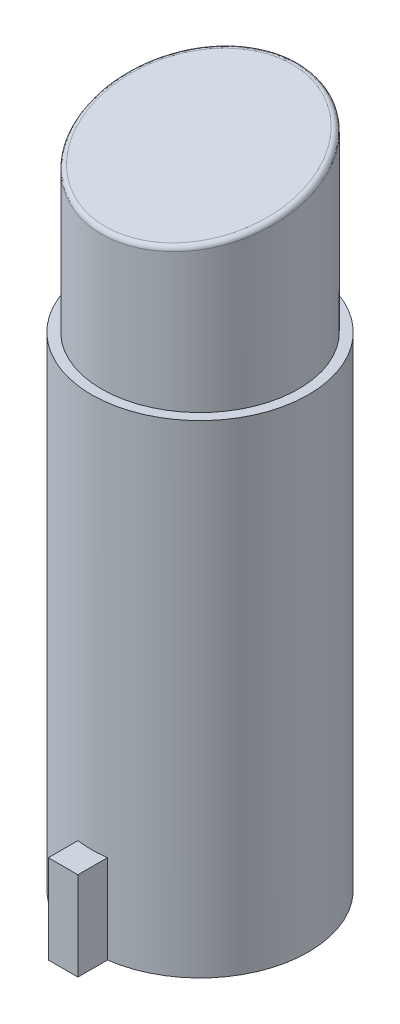
ISO-10303-21;
HEADER;
FILE_DESCRIPTION(('STEP AP214'),'2;1');
FILE_NAME('part.step','',(''),(''),'','','');
FILE_SCHEMA(('AUTOMOTIVE_DESIGN { 1 0 10303 214 1 1 1 1 }'));
ENDSEC;
DATA;
#1=APPLICATION_CONTEXT('core data for automotive mechanical design processes');
#2=APPLICATION_PROTOCOL_DEFINITION('international standard','automotive_design',2000,#1);
#3=PRODUCT_CONTEXT('',#1,'mechanical');
#4=PRODUCT('Part','Part','',(#3));
#5=PRODUCT_RELATED_PRODUCT_CATEGORY('part','',(#4));
#6=PRODUCT_DEFINITION_FORMATION('','',#4);
#7=PRODUCT_DEFINITION_CONTEXT('part definition',#1,'design');
#8=PRODUCT_DEFINITION('design','',#6,#7);
#9=PRODUCT_DEFINITION_SHAPE('','',#8);
#10=(LENGTH_UNIT() NAMED_UNIT(*) SI_UNIT(.MILLI.,.METRE.));
#11=(NAMED_UNIT(*) PLANE_ANGLE_UNIT() SI_UNIT($,.RADIAN.));
#12=(NAMED_UNIT(*) SI_UNIT($,.STERADIAN.) SOLID_ANGLE_UNIT());
#13=UNCERTAINTY_MEASURE_WITH_UNIT(LENGTH_MEASURE(1.E-05),#10,'distance_accuracy_value','');
#14=(GEOMETRIC_REPRESENTATION_CONTEXT(3) GLOBAL_UNCERTAINTY_ASSIGNED_CONTEXT((#13)) GLOBAL_UNIT_ASSIGNED_CONTEXT((#10,
#11,#12)) REPRESENTATION_CONTEXT('',''));
#15=CARTESIAN_POINT('',(0.,0.,0.));
#16=DIRECTION('',(0.,0.,1.));
#17=DIRECTION('',(1.,0.,0.));
#18=AXIS2_PLACEMENT_3D('',#15,#16,#17);
#19=CARTESIAN_POINT('',(0.,68.,0.));
#20=DIRECTION('',(0.,-1.,0.));
#21=DIRECTION('',(0.,0.,-1.));
#22=AXIS2_PLACEMENT_3D('',#19,#20,#21);
#23=CYLINDRICAL_SURFACE('',#22,11.);
#24=CARTESIAN_POINT('',(0.,9.,0.));
#25=DIRECTION('',(0.,-1.,0.));
#26=DIRECTION('',(0.,0.,-1.));
#27=AXIS2_PLACEMENT_3D('',#24,#25,#26);
#28=CIRCLE('',#27,11.);
#29=CARTESIAN_POINT('',(1.5,9.,10.8972473588517));
#30=VERTEX_POINT('',#29);
#31=CARTESIAN_POINT('',(-1.50000000000001,9.,10.8972473588517));
#32=VERTEX_POINT('',#31);
#33=EDGE_CURVE('E11',#30,#32,#28,.T.);
#34=ORIENTED_EDGE('',*,*,#33,.F.);
#35=DIRECTION('',(0.,-1.,0.));
#36=VECTOR('',#35,1.);
#37=CARTESIAN_POINT('',(1.5,9.,10.8972473588517));
#38=LINE('',#37,#36);
#39=CARTESIAN_POINT('',(1.5,0.,10.8972473588517));
#40=VERTEX_POINT('',#39);
#41=EDGE_CURVE('E92',#30,#40,#38,.T.);
#42=ORIENTED_EDGE('',*,*,#41,.T.);
#43=CARTESIAN_POINT('',(0.,0.,0.));
#44=DIRECTION('',(0.,1.,0.));
#45=DIRECTION('',(0.,0.,1.));
#46=AXIS2_PLACEMENT_3D('',#43,#44,#45);
#47=CIRCLE('',#46,11.);
#48=CARTESIAN_POINT('',(-1.5,0.,10.8972473588517));
#49=VERTEX_POINT('',#48);
#50=EDGE_CURVE('E133',#40,#49,#47,.T.);
#51=ORIENTED_EDGE('',*,*,#50,.T.);
#52=DIRECTION('',(0.,-1.,0.));
#53=VECTOR('',#52,1.);
#54=CARTESIAN_POINT('',(-1.5,9.,10.8972473588517));
#55=LINE('',#54,#53);
#56=EDGE_CURVE('E58',#32,#49,#55,.T.);
#57=ORIENTED_EDGE('',*,*,#56,.F.);
#58=EDGE_LOOP('',(#34,#42,#51,#57));
#59=FACE_BOUND('',#58,.T.);
#60=CARTESIAN_POINT('',(0.,49.,0.));
#61=DIRECTION('',(0.,1.,0.));
#62=DIRECTION('',(0.,0.,1.));
#63=AXIS2_PLACEMENT_3D('',#60,#61,#62);
#64=CIRCLE('',#63,11.);
#65=CARTESIAN_POINT('',(0.,49.,11.));
#66=VERTEX_POINT('',#65);
#67=EDGE_CURVE('E130',#66,#66,#64,.T.);
#68=ORIENTED_EDGE('',*,*,#67,.F.);
#69=EDGE_LOOP('',(#68));
#70=FACE_BOUND('',#69,.T.);
#71=ADVANCED_FACE('F41',(#59,#70),#23,.T.);
#72=CARTESIAN_POINT('',(0.,0.,0.));
#73=DIRECTION('',(0.,1.,0.));
#74=DIRECTION('',(0.,0.,1.));
#75=AXIS2_PLACEMENT_3D('',#72,#73,#74);
#76=PLANE('',#75);
#77=CARTESIAN_POINT('',(0.,0.,0.));
#78=DIRECTION('',(0.,1.,0.));
#79=DIRECTION('',(0.,0.,1.));
#80=AXIS2_PLACEMENT_3D('',#77,#78,#79);
#81=CIRCLE('',#80,10.);
#82=CARTESIAN_POINT('',(0.,0.,10.));
#83=VERTEX_POINT('',#82);
#84=EDGE_CURVE('E119',#83,#83,#81,.T.);
#85=ORIENTED_EDGE('',*,*,#84,.T.);
#86=EDGE_LOOP('',(#85));
#87=FACE_BOUND('',#86,.T.);
#88=ORIENTED_EDGE('',*,*,#50,.F.);
#89=DIRECTION('',(0.,0.,1.));
#90=VECTOR('',#89,1.);
#91=CARTESIAN_POINT('',(1.5,0.,13.8972473588517));
#92=LINE('',#91,#90);
#93=CARTESIAN_POINT('',(1.5,0.,13.8972473588517));
#94=VERTEX_POINT('',#93);
#95=EDGE_CURVE('E110',#40,#94,#92,.T.);
#96=ORIENTED_EDGE('',*,*,#95,.T.);
#97=DIRECTION('',(-1.,0.,0.));
#98=VECTOR('',#97,1.);
#99=CARTESIAN_POINT('',(-1.5,0.,13.8972473588517));
#100=LINE('',#99,#98);
#101=CARTESIAN_POINT('',(-1.5,0.,13.8972473588517));
#102=VERTEX_POINT('',#101);
#103=EDGE_CURVE('E87',#94,#102,#100,.T.);
#104=ORIENTED_EDGE('',*,*,#103,.T.);
#105=DIRECTION('',(0.,0.,-1.));
#106=VECTOR('',#105,1.);
#107=CARTESIAN_POINT('',(-1.5,0.,13.8972473588517));
#108=LINE('',#107,#106);
#109=EDGE_CURVE('E107',#102,#49,#108,.T.);
#110=ORIENTED_EDGE('',*,*,#109,.T.);
#111=EDGE_LOOP('',(#88,#96,#104,#110));
#112=FACE_BOUND('',#111,.T.);
#113=ADVANCED_FACE('F159',(#87,#112),#76,.F.);
#114=CARTESIAN_POINT('',(0.,49.,0.));
#115=DIRECTION('',(0.,1.,0.));
#116=DIRECTION('',(0.,0.,1.));
#117=AXIS2_PLACEMENT_3D('',#114,#115,#116);
#118=PLANE('',#117);
#119=CARTESIAN_POINT('',(0.,49.,0.));
#120=DIRECTION('',(0.,1.,0.));
#121=DIRECTION('',(0.,0.,1.));
#122=AXIS2_PLACEMENT_3D('',#119,#120,#121);
#123=CIRCLE('',#122,10.);
#124=CARTESIAN_POINT('',(0.,49.,10.));
#125=VERTEX_POINT('',#124);
#126=EDGE_CURVE('E125',#125,#125,#123,.T.);
#127=ORIENTED_EDGE('',*,*,#126,.F.);
#128=EDGE_LOOP('',(#127));
#129=FACE_BOUND('',#128,.T.);
#130=ORIENTED_EDGE('',*,*,#67,.T.);
#131=EDGE_LOOP('',(#130));
#132=FACE_BOUND('',#131,.T.);
#133=ADVANCED_FACE('F155',(#129,#132),#118,.T.);
#134=CARTESIAN_POINT('',(0.,49.,0.));
#135=DIRECTION('',(0.,1.,0.));
#136=DIRECTION('',(0.,0.,1.));
#137=AXIS2_PLACEMENT_3D('',#134,#135,#136);
#138=CYLINDRICAL_SURFACE('',#137,10.);
#139=CARTESIAN_POINT('',(0.,64.9846117967978,0.));
#140=DIRECTION('',(0.,0.972936550719561,0.231072430795896));
#141=DIRECTION('',(0.,0.231072430795896,-0.97293655071956));
#142=AXIS2_PLACEMENT_3D('',#139,#140,#141);
#143=ELLIPSE('',#142,10.2781625303359,10.);
#144=CARTESIAN_POINT('',(0.,67.3596117967978,-10.));
#145=VERTEX_POINT('',#144);
#146=EDGE_CURVE('E51',#145,#145,#143,.F.);
#147=ORIENTED_EDGE('',*,*,#146,.T.);
#148=EDGE_LOOP('',(#147));
#149=FACE_BOUND('',#148,.T.);
#150=ORIENTED_EDGE('',*,*,#126,.T.);
#151=EDGE_LOOP('',(#150));
#152=FACE_BOUND('',#151,.T.);
#153=ADVANCED_FACE('F142',(#149,#152),#138,.T.);
#154=CARTESIAN_POINT('',(-11.,61.6470588235294,15.4117647058824));
#155=DIRECTION('',(0.,-0.970142500145332,-0.242535625036333));
#156=DIRECTION('',(0.,0.242535625036333,-0.970142500145332));
#157=AXIS2_PLACEMENT_3D('',#154,#155,#156);
#158=PLANE('',#157);
#159=CARTESIAN_POINT('',(0.,65.4696830468705,0.121267812518167));
#160=DIRECTION('',(0.,-0.970142500145332,-0.242535625036333));
#161=DIRECTION('',(0.,0.242535625036333,-0.970142500145332));
#162=AXIS2_PLACEMENT_3D('',#159,#160,#161);
#163=ELLIPSE('',#162,9.79237586084194,9.5);
#164=CARTESIAN_POINT('',(0.,67.8446830468705,-9.37873218748183));
#165=VERTEX_POINT('',#164);
#166=EDGE_CURVE('E135',#165,#165,#163,.F.);
#167=ORIENTED_EDGE('',*,*,#166,.T.);
#168=EDGE_LOOP('',(#167));
#169=FACE_BOUND('',#168,.T.);
#170=ADVANCED_FACE('F148',(#169),#158,.F.);
#171=CARTESIAN_POINT('',(0.,67.8446830468705,-9.37873218748183));
#172=CARTESIAN_POINT('',(0.,68.,-10.));
#173=CARTESIAN_POINT('',(0.,67.3596117967978,-10.));
#174=CARTESIAN_POINT('',(0.414588322119507,67.8446830468705,-9.37873218748183));
#175=CARTESIAN_POINT('',(0.443397472491792,68.,-10.));
#176=CARTESIAN_POINT('',(0.436408760125797,67.3596117967978,-10.));
#177=CARTESIAN_POINT('',(0.829176644239015,67.8378859896631,-9.35154395865237));
#178=CARTESIAN_POINT('',(0.886388535887809,67.9926280279265,-9.97051211170579));
#179=CARTESIAN_POINT('',(0.872817520251595,67.3528147395904,-9.97138081175846));
#180=CARTESIAN_POINT('',(1.65125437182284,67.8108289322911,-9.24331572916438));
#181=CARTESIAN_POINT('',(1.76512234340273,67.9632474429267,-9.85298977170675));
#182=CARTESIAN_POINT('',(1.73816249665562,67.3257576822185,-9.85745635966583));
#183=CARTESIAN_POINT('',(2.0587358275217,67.790554738039,-9.16221895215596));
#184=CARTESIAN_POINT('',(2.20007915454317,67.9412764702645,-9.76510588105795));
#185=CARTESIAN_POINT('',(2.16709034475968,67.3054834879663,-9.77209133123591));
#186=CARTESIAN_POINT('',(2.8596391475691,67.7369045621638,-8.94761824865517));
#187=CARTESIAN_POINT('',(3.05482521224532,67.8830933027124,-9.53237321084964));
#188=CARTESIAN_POINT('',(3.01014647112537,67.2518333120912,-9.54619585386667));
#189=CARTESIAN_POINT('',(3.2530307514293,67.7035020340501,-8.81400813620032));
#190=CARTESIAN_POINT('',(3.47390641971364,67.8469528857438,-9.38781154297509));
#191=CARTESIAN_POINT('',(3.42424289624137,67.2184307839774,-9.40555363022998));
#192=CARTESIAN_POINT('',(4.01904893470162,67.6241785032727,-8.49671401309063));
#193=CARTESIAN_POINT('',(4.2893112662052,67.7611022710253,-9.0444090841012));
#194=CARTESIAN_POINT('',(4.2305778260017,67.1391072532,-9.07155981643031));
#195=CARTESIAN_POINT('',(4.39161287042836,67.5782219506759,-8.31288780270373));
#196=CARTESIAN_POINT('',(4.68504800674092,67.7114914781052,-8.84596591242077));
#197=CARTESIAN_POINT('',(4.62275038992459,67.0931507006033,-8.87805854233883));
#198=CARTESIAN_POINT('',(5.10963565480883,67.4745846024912,-7.89833840996491));
#199=CARTESIAN_POINT('',(5.44667044086406,67.5996267352812,-8.39850694112493));
#200=CARTESIAN_POINT('',(5.37856384716719,66.9895133524186,-8.44169076050851));
#201=CARTESIAN_POINT('',(5.45499555497909,67.4168635205126,-7.66745408205051));
#202=CARTESIAN_POINT('',(5.81212226389443,67.5374911622362,-8.14996464894474));
#203=CARTESIAN_POINT('',(5.74210058418852,66.93179227044,-8.19865462586176));
#204=CARTESIAN_POINT('',(6.11273792114763,67.2906880189861,-7.16275207594434));
#205=CARTESIAN_POINT('',(6.50671772517158,67.4017314997862,-7.60692599914486));
#206=CARTESIAN_POINT('',(6.43446096962908,66.8056167689134,-7.66738935627633));
#207=CARTESIAN_POINT('',(6.42498802169246,67.2221930498948,-6.88877219957917));
#208=CARTESIAN_POINT('',(6.83559930712421,67.3282349916232,-7.31293996649273));
#209=CARTESIAN_POINT('',(6.76314528599207,66.7371217998221,-7.37898948641825));
#210=CARTESIAN_POINT('',(7.01120015929777,67.0756404206721,-6.30256168268832));
#211=CARTESIAN_POINT('',(7.45134346005477,67.1711052349909,-6.68442093996351));
#212=CARTESIAN_POINT('',(7.38021069399766,66.5905691705994,-6.76192578442788));
#213=CARTESIAN_POINT('',(7.28500554891093,66.9975459375981,-5.9901837503925));
#214=CARTESIAN_POINT('',(7.73812153740155,67.0875988820034,-6.35039552801354));
#215=CARTESIAN_POINT('',(7.66842689359045,66.5124746875255,-6.43310690832701));
#216=CARTESIAN_POINT('',(7.78966452262592,66.8331252764524,-5.33250110580946));
#217=CARTESIAN_POINT('',(8.26477609785752,66.9119659719753,-5.64786388790102));
#218=CARTESIAN_POINT('',(8.19964686592202,66.3480540263797,-5.74080938771329));
#219=CARTESIAN_POINT('',(8.0203510127341,66.7467689586196,-4.98707583447837));
#220=CARTESIAN_POINT('',(8.50473978195985,66.819956408189,-5.27982563275572));
#221=CARTESIAN_POINT('',(8.44247475024642,66.2616977085469,-5.37720383894372));
#222=CARTESIAN_POINT('',(8.43483104012278,66.5672942950497,-4.26917718019896));
#223=CARTESIAN_POINT('',(8.9337693675898,66.6289660214415,-4.51586408576579));
#224=CARTESIAN_POINT('',(8.87876951591871,66.0822230449771,-4.6215210449654));
#225=CARTESIAN_POINT('',(8.61846342230174,66.4741540774903,-3.89661630996113));
#226=CARTESIAN_POINT('',(9.12307883493533,66.5300842813615,-4.12033712544587));
#227=CARTESIAN_POINT('',(9.07206676031762,65.9890828274176,-4.22935170787294));
#228=CARTESIAN_POINT('',(8.93568207426906,66.2826961497904,-3.13078459916139));
#229=CARTESIAN_POINT('',(9.44772947282321,66.3270993424468,-3.30839736978699));
#230=CARTESIAN_POINT('',(9.40598113080954,65.7976248997177,-3.42321306492585));
#231=CARTESIAN_POINT('',(9.06912971517071,66.1843649412537,-2.73745976501477));
#232=CARTESIAN_POINT('',(9.58344808278561,66.2230708030245,-2.89228321209807));
#233=CARTESIAN_POINT('',(9.54645233175864,65.6992936911811,-3.00918692371888));
#234=CARTESIAN_POINT('',(9.28366774748412,65.9841987045226,-1.93679481809041));
#235=CARTESIAN_POINT('',(9.79879678829137,66.011612357633,-2.04644943053182));
#236=CARTESIAN_POINT('',(9.77228183945697,65.4991274544499,-2.16638171643008));
#237=CARTESIAN_POINT('',(9.36465662514034,65.8823572821693,-1.52942912867701));
#238=CARTESIAN_POINT('',(9.87891058396965,65.904227775646,-1.61691110258385));
#239=CARTESIAN_POINT('',(9.85753328962141,65.3972860320966,-1.73757572757387));
#240=CARTESIAN_POINT('',(9.47284955866084,65.676906028352,-0.707624113408069));
#241=CARTESIAN_POINT('',(9.98189256106205,65.6879179004039,-0.751671601615529));
#242=CARTESIAN_POINT('',(9.97142058806404,65.1918347782794,-0.872517816764458));
#243=CARTESIAN_POINT('',(9.5,65.5732945376112,-0.293178150444952));
#244=CARTESIAN_POINT('',(10.0053195727561,65.5790052972128,-0.316021188851122));
#245=CARTESIAN_POINT('',(10.,65.0882232875386,-0.43625890838223));
#246=CARTESIAN_POINT('',(9.5,65.3660715561297,0.535713775481284));
#247=CARTESIAN_POINT('',(9.99473641658265,65.3615114303831,0.55395427846743));
#248=CARTESIAN_POINT('',(10.,64.881000306057,0.436258908382228));
#249=CARTESIAN_POINT('',(9.47284955866084,65.2624600653889,0.950159738444401));
#250=CARTESIAN_POINT('',(9.96132676059427,65.2529085343777,0.988365862489461));
#251=CARTESIAN_POINT('',(9.97142058806404,64.7773888153162,0.872517816764457));
#252=CARTESIAN_POINT('',(9.36465662514034,65.0570088115717,1.77196475371334));
#253=CARTESIAN_POINT('',(9.83783644618665,65.0378886925759,1.84844522969654));
#254=CARTESIAN_POINT('',(9.85753328962141,64.571937561499,1.73757572757387));
#255=CARTESIAN_POINT('',(9.28366774748412,64.9551673892183,2.17933044312674));
#256=CARTESIAN_POINT('',(9.74836318413177,64.9314157449018,2.27433702039275));
#257=CARTESIAN_POINT('',(9.77228183945697,64.4700961391457,2.16638171643007));
#258=CARTESIAN_POINT('',(9.06912971517071,64.7550011524873,2.9799953900511));
#259=CARTESIAN_POINT('',(9.51445096943864,64.722464375443,3.11014249822805));
#260=CARTESIAN_POINT('',(9.54645233175865,64.2699299024146,3.00918692371888));
#261=CARTESIAN_POINT('',(8.93568207426906,64.6566699439506,3.37332022419772));
#262=CARTESIAN_POINT('',(9.37059113215234,64.6198972587353,3.52041096505868));
#263=CARTESIAN_POINT('',(9.40598113080954,64.1715986938779,3.42321306492585));
#264=CARTESIAN_POINT('',(8.61846342230174,64.4652120162506,4.13915193499746));
#265=CARTESIAN_POINT('',(9.0305197814216,64.4204918232799,4.31803270688062));
#266=CARTESIAN_POINT('',(9.07206676031762,63.980140766178,4.22935170787294));
#267=CARTESIAN_POINT('',(8.43483104012278,64.3720717986912,4.51171280523529));
#268=CARTESIAN_POINT('',(8.83482479660085,64.3235356294991,4.70585748200349));
#269=CARTESIAN_POINT('',(8.87876951591871,63.8870005486185,4.62152104496539));
#270=CARTESIAN_POINT('',(8.0203510127341,64.1925971351213,5.2296114595147));
#271=CARTESIAN_POINT('',(8.39456253727597,64.1369843294259,5.45206268229645));
#272=CARTESIAN_POINT('',(8.44247475024642,63.7075258850487,5.37720383894372));
#273=CARTESIAN_POINT('',(7.78966452262592,64.1062408172886,5.57503673084579));
#274=CARTESIAN_POINT('',(8.15041740613061,64.0472476104838,5.81100955806494));
#275=CARTESIAN_POINT('',(8.19964686592202,63.6211695672159,5.74080938771329));
#276=CARTESIAN_POINT('',(7.28500554891093,63.9418201561428,6.23271937542883));
#277=CARTESIAN_POINT('',(7.6175425113083,63.8766389025516,6.49344438979347));
#278=CARTESIAN_POINT('',(7.66842689359045,63.4567489060701,6.43310690832701));
#279=CARTESIAN_POINT('',(7.01120015929777,63.8637256730688,6.54509730772465));
#280=CARTESIAN_POINT('',(7.32911333314964,63.7956089362778,6.81756425488883));
#281=CARTESIAN_POINT('',(7.38021069399766,63.3786544229962,6.76192578442788));
#282=CARTESIAN_POINT('',(6.42498802169246,63.7171730438461,7.1313078246155));
#283=CARTESIAN_POINT('',(6.71269494517991,63.643763637612,7.42494544955216));
#284=CARTESIAN_POINT('',(6.76314528599207,63.2321017937735,7.37898948641825));
#285=CARTESIAN_POINT('',(6.11273792114763,63.6486780747548,7.40528770098068));
#286=CARTESIAN_POINT('',(6.38486469806308,63.5727830955539,7.70886761778443));
#287=CARTESIAN_POINT('',(6.43446096962908,63.1636068246822,7.66738935627633));
#288=CARTESIAN_POINT('',(5.45499555497909,63.5225025732283,7.90998970708684));
#289=CARTESIAN_POINT('',(5.69532031415741,63.4422099483593,8.2311602065627));
#290=CARTESIAN_POINT('',(5.74210058418852,63.0374313231556,8.19865462586176));
#291=CARTESIAN_POINT('',(5.10963565480884,63.4647814912497,8.14087403500125));
#292=CARTESIAN_POINT('',(5.3336131148376,63.3824553811074,8.47017847557047));
#293=CARTESIAN_POINT('',(5.37856384716719,62.979710241177,8.44169076050851));
#294=CARTESIAN_POINT('',(4.39161287042836,63.361144143065,8.55542342774006));
#295=CARTESIAN_POINT('',(4.58254394608284,63.2753109560128,8.89875617594906));
#296=CARTESIAN_POINT('',(4.62275038992459,62.8760728929923,8.87805854233883));
#297=CARTESIAN_POINT('',(4.01904893470162,63.3151875904683,8.73924963812696));
#298=CARTESIAN_POINT('',(4.19303832472046,63.2277735263793,9.08890589448292));
#299=CARTESIAN_POINT('',(4.2305778260017,62.8301163403956,9.07155981643031));
#300=CARTESIAN_POINT('',(3.2530307514293,63.2358640596909,9.05654376123665));
#301=CARTESIAN_POINT('',(3.39304447166013,63.1458273049449,9.41669078022047));
#302=CARTESIAN_POINT('',(3.42424289624137,62.7507928096182,9.40555363022998));
#303=CARTESIAN_POINT('',(2.8596391475691,63.2024615315771,9.19015387369151));
#304=CARTESIAN_POINT('',(2.98227652547892,63.1112962043913,9.55481518243504));
#305=CARTESIAN_POINT('',(3.01014647112537,62.7173902815045,9.54619585386667));
#306=CARTESIAN_POINT('',(2.0587358275217,63.1488113557019,9.40475457719229));
#307=CARTESIAN_POINT('',(2.1467545742878,63.0559016074924,9.77639357003047));
#308=CARTESIAN_POINT('',(2.16709034475969,62.6637401056293,9.77209133123591));
#309=CARTESIAN_POINT('',(1.65125437182284,63.1285371614498,9.48585135420071));
#310=CARTESIAN_POINT('',(1.72161223603866,63.0349505835181,9.86019766592744));
#311=CARTESIAN_POINT('',(1.73816249665562,62.6434659113772,9.85745635966583));
#312=CARTESIAN_POINT('',(0.829176644239019,63.1014801040778,9.5940795836887));
#313=CARTESIAN_POINT('',(0.864538467471946,63.0070226087836,9.97190956486574));
#314=CARTESIAN_POINT('',(0.872817520251598,62.6164088540052,9.97138081175846));
#315=CARTESIAN_POINT('',(0.41458832211951,63.0946830468705,9.62126781251816));
#316=CARTESIAN_POINT('',(0.43214854504974,63.,10.));
#317=CARTESIAN_POINT('',(0.4364087601258,62.6096117967978,10.));
#318=CARTESIAN_POINT('',(-0.414588322119508,63.0946830468705,9.62126781251816));
#319=CARTESIAN_POINT('',(-0.432148545049738,63.,10.));
#320=CARTESIAN_POINT('',(-0.436408760125798,62.6096117967978,10.));
#321=CARTESIAN_POINT('',(-0.829176644239017,63.1014801040778,9.5940795836887));
#322=CARTESIAN_POINT('',(-0.864538467471945,63.0070226087836,9.97190956486574));
#323=CARTESIAN_POINT('',(-0.872817520251597,62.6164088540052,9.97138081175846));
#324=CARTESIAN_POINT('',(-1.65125437182284,63.1285371614498,9.48585135420071));
#325=CARTESIAN_POINT('',(-1.72161223603866,63.0349505835181,9.86019766592744));
#326=CARTESIAN_POINT('',(-1.73816249665562,62.6434659113772,9.85745635966583));
#327=CARTESIAN_POINT('',(-2.0587358275217,63.1488113557019,9.40475457719229));
#328=CARTESIAN_POINT('',(-2.1467545742878,63.0559016074924,9.77639357003047));
#329=CARTESIAN_POINT('',(-2.16709034475968,62.6637401056293,9.77209133123591));
#330=CARTESIAN_POINT('',(-2.8596391475691,63.2024615315771,9.19015387369151));
#331=CARTESIAN_POINT('',(-2.98227652547892,63.1112962043913,9.55481518243505));
#332=CARTESIAN_POINT('',(-3.01014647112536,62.7173902815045,9.54619585386667));
#333=CARTESIAN_POINT('',(-3.2530307514293,63.2358640596909,9.05654376123665));
#334=CARTESIAN_POINT('',(-3.39304447166012,63.1458273049449,9.41669078022047));
#335=CARTESIAN_POINT('',(-3.42424289624137,62.7507928096182,9.40555363022998));
#336=CARTESIAN_POINT('',(-4.01904893470162,63.3151875904683,8.73924963812696));
#337=CARTESIAN_POINT('',(-4.19303832472045,63.2277735263793,9.08890589448292));
#338=CARTESIAN_POINT('',(-4.2305778260017,62.8301163403956,9.07155981643031));
#339=CARTESIAN_POINT('',(-4.39161287042836,63.361144143065,8.55542342774006));
#340=CARTESIAN_POINT('',(-4.58254394608284,63.2753109560128,8.89875617594906));
#341=CARTESIAN_POINT('',(-4.62275038992459,62.8760728929923,8.87805854233884));
#342=CARTESIAN_POINT('',(-5.10963565480883,63.4647814912497,8.14087403500125));
#343=CARTESIAN_POINT('',(-5.3336131148376,63.3824553811074,8.47017847557047));
#344=CARTESIAN_POINT('',(-5.37856384716719,62.979710241177,8.44169076050851));
#345=CARTESIAN_POINT('',(-5.45499555497909,63.5225025732283,7.90998970708684));
#346=CARTESIAN_POINT('',(-5.69532031415741,63.4422099483593,8.23116020656271));
#347=CARTESIAN_POINT('',(-5.74210058418852,63.0374313231556,8.19865462586177));
#348=CARTESIAN_POINT('',(-6.11273792114762,63.6486780747548,7.40528770098068));
#349=CARTESIAN_POINT('',(-6.38486469806308,63.5727830955539,7.70886761778443));
#350=CARTESIAN_POINT('',(-6.43446096962908,63.1636068246822,7.66738935627633));
#351=CARTESIAN_POINT('',(-6.42498802169246,63.7171730438461,7.1313078246155));
#352=CARTESIAN_POINT('',(-6.71269494517991,63.643763637612,7.42494544955216));
#353=CARTESIAN_POINT('',(-6.76314528599206,63.2321017937735,7.37898948641825));
#354=CARTESIAN_POINT('',(-7.01120015929777,63.8637256730688,6.54509730772465));
#355=CARTESIAN_POINT('',(-7.32911333314963,63.7956089362778,6.81756425488884));
#356=CARTESIAN_POINT('',(-7.38021069399765,63.3786544229962,6.76192578442788));
#357=CARTESIAN_POINT('',(-7.28500554891093,63.9418201561428,6.23271937542883));
#358=CARTESIAN_POINT('',(-7.6175425113083,63.8766389025516,6.49344438979348));
#359=CARTESIAN_POINT('',(-7.66842689359045,63.4567489060701,6.43310690832702));
#360=CARTESIAN_POINT('',(-7.78966452262592,64.1062408172886,5.57503673084579));
#361=CARTESIAN_POINT('',(-8.15041740613061,64.0472476104838,5.81100955806494));
#362=CARTESIAN_POINT('',(-8.19964686592201,63.6211695672159,5.74080938771329));
#363=CARTESIAN_POINT('',(-8.0203510127341,64.1925971351213,5.2296114595147));
#364=CARTESIAN_POINT('',(-8.39456253727597,64.1369843294259,5.45206268229646));
#365=CARTESIAN_POINT('',(-8.44247475024642,63.7075258850487,5.37720383894372));
#366=CARTESIAN_POINT('',(-8.43483104012278,64.3720717986912,4.5117128052353));
#367=CARTESIAN_POINT('',(-8.83482479660085,64.3235356294991,4.70585748200349));
#368=CARTESIAN_POINT('',(-8.87876951591871,63.8870005486185,4.6215210449654));
#369=CARTESIAN_POINT('',(-8.61846342230174,64.4652120162506,4.13915193499746));
#370=CARTESIAN_POINT('',(-9.0305197814216,64.4204918232799,4.31803270688062));
#371=CARTESIAN_POINT('',(-9.07206676031761,63.980140766178,4.22935170787294));
#372=CARTESIAN_POINT('',(-8.93568207426906,64.6566699439506,3.37332022419772));
#373=CARTESIAN_POINT('',(-9.37059113215234,64.6198972587353,3.52041096505868));
#374=CARTESIAN_POINT('',(-9.40598113080954,64.1715986938779,3.42321306492585));
#375=CARTESIAN_POINT('',(-9.06912971517071,64.7550011524873,2.9799953900511));
#376=CARTESIAN_POINT('',(-9.51445096943864,64.722464375443,3.11014249822805));
#377=CARTESIAN_POINT('',(-9.54645233175865,64.2699299024146,3.00918692371888));
#378=CARTESIAN_POINT('',(-9.28366774748412,64.9551673892183,2.17933044312674));
#379=CARTESIAN_POINT('',(-9.74836318413177,64.9314157449018,2.27433702039275));
#380=CARTESIAN_POINT('',(-9.77228183945697,64.4700961391457,2.16638171643007));
#381=CARTESIAN_POINT('',(-9.36465662514034,65.0570088115717,1.77196475371334));
#382=CARTESIAN_POINT('',(-9.83783644618665,65.0378886925759,1.84844522969654));
#383=CARTESIAN_POINT('',(-9.85753328962141,64.571937561499,1.73757572757387));
#384=CARTESIAN_POINT('',(-9.47284955866084,65.2624600653889,0.950159738444402));
#385=CARTESIAN_POINT('',(-9.96132676059427,65.2529085343777,0.988365862489462));
#386=CARTESIAN_POINT('',(-9.97142058806404,64.7773888153162,0.872517816764458));
#387=CARTESIAN_POINT('',(-9.5,65.3660715561297,0.535713775481285));
#388=CARTESIAN_POINT('',(-9.99473641658265,65.3615114303831,0.553954278467431));
#389=CARTESIAN_POINT('',(-10.,64.881000306057,0.43625890838223));
#390=CARTESIAN_POINT('',(-9.5,65.5732945376112,-0.293178150444949));
#391=CARTESIAN_POINT('',(-10.0053195727561,65.5790052972128,-0.316021188851119));
#392=CARTESIAN_POINT('',(-10.,65.0882232875386,-0.436258908382226));
#393=CARTESIAN_POINT('',(-9.47284955866084,65.676906028352,-0.707624113408066));
#394=CARTESIAN_POINT('',(-9.98189256106205,65.6879179004039,-0.751671601615526));
#395=CARTESIAN_POINT('',(-9.97142058806404,65.1918347782794,-0.872517816764455));
#396=CARTESIAN_POINT('',(-9.36465662514034,65.8823572821693,-1.52942912867701));
#397=CARTESIAN_POINT('',(-9.87891058396965,65.904227775646,-1.61691110258384));
#398=CARTESIAN_POINT('',(-9.85753328962141,65.3972860320966,-1.73757572757386));
#399=CARTESIAN_POINT('',(-9.28366774748412,65.9841987045226,-1.9367948180904));
#400=CARTESIAN_POINT('',(-9.79879678829137,66.011612357633,-2.04644943053181));
#401=CARTESIAN_POINT('',(-9.77228183945697,65.4991274544499,-2.16638171643007));
#402=CARTESIAN_POINT('',(-9.06912971517072,66.1843649412537,-2.73745976501476));
#403=CARTESIAN_POINT('',(-9.58344808278561,66.2230708030245,-2.89228321209806));
#404=CARTESIAN_POINT('',(-9.54645233175865,65.6992936911811,-3.00918692371887));
#405=CARTESIAN_POINT('',(-8.93568207426907,66.2826961497904,-3.13078459916139));
#406=CARTESIAN_POINT('',(-9.44772947282321,66.3270993424468,-3.30839736978699));
#407=CARTESIAN_POINT('',(-9.40598113080954,65.7976248997177,-3.42321306492585));
#408=CARTESIAN_POINT('',(-8.61846342230174,66.4741540774903,-3.89661630996112));
#409=CARTESIAN_POINT('',(-9.12307883493533,66.5300842813615,-4.12033712544587));
#410=CARTESIAN_POINT('',(-9.07206676031762,65.9890828274176,-4.22935170787293));
#411=CARTESIAN_POINT('',(-8.43483104012278,66.5672942950497,-4.26917718019896));
#412=CARTESIAN_POINT('',(-8.9337693675898,66.6289660214415,-4.51586408576579));
#413=CARTESIAN_POINT('',(-8.87876951591871,66.0822230449771,-4.6215210449654));
#414=CARTESIAN_POINT('',(-8.0203510127341,66.7467689586196,-4.98707583447837));
#415=CARTESIAN_POINT('',(-8.50473978195986,66.819956408189,-5.27982563275572));
#416=CARTESIAN_POINT('',(-8.44247475024642,66.2616977085469,-5.37720383894372));
#417=CARTESIAN_POINT('',(-7.78966452262592,66.8331252764524,-5.33250110580945));
#418=CARTESIAN_POINT('',(-8.26477609785753,66.9119659719753,-5.64786388790101));
#419=CARTESIAN_POINT('',(-8.19964686592202,66.3480540263797,-5.74080938771328));
#420=CARTESIAN_POINT('',(-7.28500554891093,66.9975459375981,-5.99018375039249));
#421=CARTESIAN_POINT('',(-7.73812153740156,67.0875988820034,-6.35039552801354));
#422=CARTESIAN_POINT('',(-7.66842689359046,66.5124746875255,-6.43310690832701));
#423=CARTESIAN_POINT('',(-7.01120015929778,67.0756404206721,-6.30256168268832));
#424=CARTESIAN_POINT('',(-7.45134346005477,67.1711052349909,-6.6844209399635));
#425=CARTESIAN_POINT('',(-7.38021069399766,66.5905691705994,-6.76192578442787));
#426=CARTESIAN_POINT('',(-6.42498802169246,67.2221930498948,-6.88877219957917));
#427=CARTESIAN_POINT('',(-6.83559930712421,67.3282349916232,-7.31293996649273));
#428=CARTESIAN_POINT('',(-6.76314528599207,66.7371217998221,-7.37898948641825));
#429=CARTESIAN_POINT('',(-6.11273792114763,67.2906880189861,-7.16275207594434));
#430=CARTESIAN_POINT('',(-6.50671772517158,67.4017314997862,-7.60692599914486));
#431=CARTESIAN_POINT('',(-6.43446096962909,66.8056167689134,-7.66738935627633));
#432=CARTESIAN_POINT('',(-5.4549955549791,67.4168635205126,-7.66745408205051));
#433=CARTESIAN_POINT('',(-5.81212226389443,67.5374911622362,-8.14996464894473));
#434=CARTESIAN_POINT('',(-5.74210058418852,66.93179227044,-8.19865462586176));
#435=CARTESIAN_POINT('',(-5.10963565480884,67.4745846024912,-7.89833840996491));
#436=CARTESIAN_POINT('',(-5.44667044086406,67.5996267352812,-8.39850694112493));
#437=CARTESIAN_POINT('',(-5.3785638471672,66.9895133524186,-8.4416907605085));
#438=CARTESIAN_POINT('',(-4.39161287042837,67.5782219506759,-8.31288780270372));
#439=CARTESIAN_POINT('',(-4.68504800674092,67.7114914781052,-8.84596591242076));
#440=CARTESIAN_POINT('',(-4.62275038992459,67.0931507006033,-8.87805854233883));
#441=CARTESIAN_POINT('',(-4.01904893470162,67.6241785032727,-8.49671401309062));
#442=CARTESIAN_POINT('',(-4.28931126620521,67.7611022710253,-9.04440908410119));
#443=CARTESIAN_POINT('',(-4.2305778260017,67.1391072532,-9.07155981643031));
#444=CARTESIAN_POINT('',(-3.2530307514293,67.7035020340501,-8.81400813620031));
#445=CARTESIAN_POINT('',(-3.47390641971364,67.8469528857438,-9.38781154297509));
#446=CARTESIAN_POINT('',(-3.42424289624137,67.2184307839774,-9.40555363022998));
#447=CARTESIAN_POINT('',(-2.8596391475691,67.7369045621638,-8.94761824865517));
#448=CARTESIAN_POINT('',(-3.05482521224532,67.8830933027124,-9.53237321084963));
#449=CARTESIAN_POINT('',(-3.01014647112537,67.2518333120912,-9.54619585386667));
#450=CARTESIAN_POINT('',(-2.0587358275217,67.790554738039,-9.16221895215596));
#451=CARTESIAN_POINT('',(-2.20007915454318,67.9412764702645,-9.76510588105794));
#452=CARTESIAN_POINT('',(-2.16709034475969,67.3054834879663,-9.77209133123591));
#453=CARTESIAN_POINT('',(-1.65125437182284,67.8108289322911,-9.24331572916438));
#454=CARTESIAN_POINT('',(-1.76512234340274,67.9632474429267,-9.85298977170675));
#455=CARTESIAN_POINT('',(-1.73816249665562,67.3257576822185,-9.85745635966583));
#456=CARTESIAN_POINT('',(-0.829176644239016,67.8378859896631,-9.35154395865237));
#457=CARTESIAN_POINT('',(-0.886388535887809,67.9926280279264,-9.97051211170579));
#458=CARTESIAN_POINT('',(-0.872817520251595,67.3528147395904,-9.97138081175846));
#459=CARTESIAN_POINT('',(-0.414588322119508,67.8446830468705,-9.37873218748183));
#460=CARTESIAN_POINT('',(-0.443397472491793,68.,-10.));
#461=CARTESIAN_POINT('',(-0.436408760125798,67.3596117967978,-10.));
#462=CARTESIAN_POINT('',(0.,67.8446830468705,-9.37873218748183));
#463=CARTESIAN_POINT('',(0.,68.,-10.));
#464=CARTESIAN_POINT('',(0.,67.3596117967978,-10.));
#465=(BOUNDED_SURFACE() B_SPLINE_SURFACE(3,2,((#171,#172,#173),(#174,#175,#176),(#177,#178,
#179),(#180,#181,#182),(#183,#184,#185),(#186,#187,#188),(#189,#190,#191),(#192,#193,#194),
(#195,#196,#197),(#198,#199,#200),(#201,#202,#203),(#204,#205,#206),(#207,#208,#209),(#210,#211,
#212),(#213,#214,#215),(#216,#217,#218),(#219,#220,#221),(#222,#223,#224),(#225,#226,#227),
(#228,#229,#230),(#231,#232,#233),(#234,#235,#236),(#237,#238,#239),(#240,#241,#242),(#243,#244,
#245),(#246,#247,#248),(#249,#250,#251),(#252,#253,#254),(#255,#256,#257),(#258,#259,#260),
(#261,#262,#263),(#264,#265,#266),(#267,#268,#269),(#270,#271,#272),(#273,#274,#275),(#276,#277,
#278),(#279,#280,#281),(#282,#283,#284),(#285,#286,#287),(#288,#289,#290),(#291,#292,#293),
(#294,#295,#296),(#297,#298,#299),(#300,#301,#302),(#303,#304,#305),(#306,#307,#308),(#309,#310,
#311),(#312,#313,#314),(#315,#316,#317),(#318,#319,#320),(#321,#322,#323),(#324,#325,#326),
(#327,#328,#329),(#330,#331,#332),(#333,#334,#335),(#336,#337,#338),(#339,#340,#341),(#342,#343,
#344),(#345,#346,#347),(#348,#349,#350),(#351,#352,#353),(#354,#355,#356),(#357,#358,#359),
(#360,#361,#362),(#363,#364,#365),(#366,#367,#368),(#369,#370,#371),(#372,#373,#374),(#375,#376,
#377),(#378,#379,#380),(#381,#382,#383),(#384,#385,#386),(#387,#388,#389),(#390,#391,#392),
(#393,#394,#395),(#396,#397,#398),(#399,#400,#401),(#402,#403,#404),(#405,#406,#407),(#408,#409,
#410),(#411,#412,#413),(#414,#415,#416),(#417,#418,#419),(#420,#421,#422),(#423,#424,#425),
(#426,#427,#428),(#429,#430,#431),(#432,#433,#434),(#435,#436,#437),(#438,#439,#440),(#441,#442,
#443),(#444,#445,#446),(#447,#448,#449),(#450,#451,#452),(#453,#454,#455),(#456,#457,#458),
(#459,#460,#461),(#462,#463,#464)),.UNSPECIFIED.,.T.,.F.,.F.) B_SPLINE_SURFACE_WITH_KNOTS((4,2,
2,2,2,2,2,2,2,2,2,2,2,2,2,2,2,2,2,2,2,2,2,2,2,2,2,2,2,2,2,2,2,2,2,2,2,2,2,2,2,2,2,2,2,2,2,2,4),
(3,3),(0.,1.24282555558285,2.48696213021434,3.73362749477145,4.98386037673922,6.23844873683863,
7.49787723262156,8.76229708602908,10.0315195836173,11.30503261556,12.5820381639014,
13.8615075403796,15.1422504263919,16.4229933124043,17.7024626888825,18.9794682372239,
20.2529812691665,21.5222037667548,22.7866236201623,24.0460521159453,25.3006404760447,
26.5508733580124,27.7975387225696,29.041675297201,30.2845008527839,31.5273264083667,
32.7714629829982,34.0181283475553,35.2683612295231,36.5229495896225,37.7823780854054,
39.046797938813,40.3160204364012,41.5895334683439,42.8665390166853,44.1460083931635,
45.4267512791758,46.7074941651882,47.9869635416664,49.2639690900078,50.5374821219504,
51.8067046195387,53.0711244729462,54.3305529687292,55.5851413288286,56.8353742107963,
58.0820395753534,59.3261761499849,60.5690017055678),(0.,1.),
.UNSPECIFIED.) GEOMETRIC_REPRESENTATION_ITEM() RATIONAL_B_SPLINE_SURFACE(((1.,0.615412209402634,
1.),(1.,0.615412209402634,1.),(1.,0.615694375867369,1.),(1.,0.616815282625894,1.),(1.,
0.617654609718584,1.),(1.,0.61986820391522,1.),(1.,0.621243554852608,1.),(1.,0.624494850309213,
1.),(1.,0.626372216088248,1.),(1.,0.630582189493078,1.),(1.,0.63291636027567,1.),(1.,
0.637985646413755,1.),(1.,0.640722273851022,1.),(1.,0.646535442258302,1.),(1.,0.649613287387173,
1.),(1.,0.656043313829691,1.),(1.,0.659396492749795,1.),(1.,0.666309093412928,1.),(1.,
0.66986917402997,1.),(1.,0.677126758429329,1.),(1.,0.680824612309602,1.),(1.,0.688289708172461,
1.),(1.,0.692057070265741,1.),(1.,0.699595161112746,1.),(1.,0.703365889485103,1.),(1.,
0.710847672887992,1.),(1.,0.714558727918524,1.),(1.,0.721861846607879,1.),(1.,0.725454024916781,
1.),(1.,0.732464346437737,1.),(1.,0.735882811462464,1.),(1.,0.742495339784363,1.),(1.,
0.745689991234268,1.),(1.,0.751809490902065,1.),(1.,0.754735211840681,1.),(1.,0.760276616452451,
1.),(1.,0.762893431392961,1.),(1.,0.767782096741409,1.),(1.,0.770055268135104,1.),(1.,
0.774227118421655,1.),(1.,0.776127202960603,1.),(1.,0.77952880730164,1.),(1.,0.781031687876345,
1.),(1.,0.783620294468565,1.),(1.,0.784707198592232,1.),(1.,0.786450745631811,1.),(1.,
0.787108256836003,1.),(1.,0.787985372669395,1.),(1.,0.78820543801611,1.),(1.,0.78820543801611,
1.),(1.,0.787985372669396,1.),(1.,0.787108256836003,1.),(1.,0.78645074563181,1.),(1.,
0.784707198592231,1.),(1.,0.783620294468565,1.),(1.,0.781031687876346,1.),(1.,0.779528807301641,
1.),(1.,0.776127202960603,1.),(1.,0.774227118421655,1.),(1.,0.770055268135104,1.),(1.,
0.76778209674141,1.),(1.,0.762893431392962,1.),(1.,0.760276616452451,1.),(1.,0.75473521184068,
1.),(1.,0.751809490902065,1.),(1.,0.745689991234267,1.),(1.,0.742495339784363,1.),(1.,
0.735882811462464,1.),(1.,0.732464346437737,1.),(1.,0.725454024916781,1.),(1.,0.721861846607879,
1.),(1.,0.714558727918524,1.),(1.,0.710847672887992,1.),(1.,0.703365889485103,1.),(1.,
0.699595161112746,1.),(1.,0.692057070265741,1.),(1.,0.688289708172461,1.),(1.,0.680824612309602,
1.),(1.,0.677126758429329,1.),(1.,0.66986917402997,1.),(1.,0.666309093412928,1.),(1.,
0.659396492749795,1.),(1.,0.656043313829691,1.),(1.,0.649613287387173,1.),(1.,0.646535442258302,
1.),(1.,0.640722273851022,1.),(1.,0.637985646413756,1.),(1.,0.63291636027567,1.),(1.,
0.630582189493079,1.),(1.,0.626372216088248,1.),(1.,0.624494850309212,1.),(1.,0.621243554852607,
1.),(1.,0.619868203915219,1.),(1.,0.617654609718584,1.),(1.,0.616815282625894,1.),(1.,
0.615694375867369,1.),(1.,0.615412209402634,1.),(1.,0.615412209402634,1.))) REPRESENTATION_ITEM('') SURFACE());
#466=CARTESIAN_POINT('',(0.,67.3596117967978,-9.5));
#467=DIRECTION('',(1.,0.,0.));
#468=DIRECTION('',(0.,0.,-1.));
#469=AXIS2_PLACEMENT_3D('',#466,#467,#468);
#470=CIRCLE('',#469,0.5);
#471=EDGE_CURVE('',#145,#165,#470,.T.);
#472=ORIENTED_EDGE('',*,*,#146,.F.);
#473=ORIENTED_EDGE('',*,*,#166,.F.);
#474=ORIENTED_EDGE('',*,*,#471,.T.);
#475=ORIENTED_EDGE('',*,*,#471,.F.);
#476=EDGE_LOOP('',(#472,#474,#473,#475));
#477=FACE_BOUND('',#476,.T.);
#478=ADVANCED_FACE('F43',(#477),#465,.T.);
#479=CARTESIAN_POINT('',(0.,68.,0.));
#480=DIRECTION('',(0.,-1.,0.));
#481=DIRECTION('',(0.,0.,-1.));
#482=AXIS2_PLACEMENT_3D('',#479,#480,#481);
#483=CYLINDRICAL_SURFACE('',#482,10.);
#484=ORIENTED_EDGE('',*,*,#84,.F.);
#485=EDGE_LOOP('',(#484));
#486=FACE_BOUND('',#485,.T.);
#487=CARTESIAN_POINT('',(0.,48.,0.));
#488=DIRECTION('',(0.,1.,0.));
#489=DIRECTION('',(0.,0.,1.));
#490=AXIS2_PLACEMENT_3D('',#487,#488,#489);
#491=CIRCLE('',#490,10.);
#492=CARTESIAN_POINT('',(0.,48.,10.));
#493=VERTEX_POINT('',#492);
#494=EDGE_CURVE('E116',#493,#493,#491,.T.);
#495=ORIENTED_EDGE('',*,*,#494,.T.);
#496=EDGE_LOOP('',(#495));
#497=FACE_BOUND('',#496,.T.);
#498=ADVANCED_FACE('F147',(#486,#497),#483,.F.);
#499=CARTESIAN_POINT('',(0.,48.,0.));
#500=DIRECTION('',(0.,1.,0.));
#501=DIRECTION('',(0.,0.,1.));
#502=AXIS2_PLACEMENT_3D('',#499,#500,#501);
#503=PLANE('',#502);
#504=CARTESIAN_POINT('',(0.,48.,0.));
#505=DIRECTION('',(0.,1.,0.));
#506=DIRECTION('',(0.,0.,1.));
#507=AXIS2_PLACEMENT_3D('',#504,#505,#506);
#508=CIRCLE('',#507,9.);
#509=CARTESIAN_POINT('',(0.,48.,9.));
#510=VERTEX_POINT('',#509);
#511=EDGE_CURVE('E113',#510,#510,#508,.T.);
#512=ORIENTED_EDGE('',*,*,#511,.T.);
#513=EDGE_LOOP('',(#512));
#514=FACE_BOUND('',#513,.T.);
#515=ORIENTED_EDGE('',*,*,#494,.F.);
#516=EDGE_LOOP('',(#515));
#517=FACE_BOUND('',#516,.T.);
#518=ADVANCED_FACE('F202',(#514,#517),#503,.F.);
#519=CARTESIAN_POINT('',(0.,49.,0.));
#520=DIRECTION('',(0.,1.,0.));
#521=DIRECTION('',(0.,0.,1.));
#522=AXIS2_PLACEMENT_3D('',#519,#520,#521);
#523=CYLINDRICAL_SURFACE('',#522,9.);
#524=CARTESIAN_POINT('',(0.,64.4692235935956,0.));
#525=DIRECTION('',(0.,-0.970142500145332,-0.242535625036333));
#526=DIRECTION('',(0.,0.242535625036333,-0.970142500145332));
#527=AXIS2_PLACEMENT_3D('',#524,#525,#526);
#528=ELLIPSE('',#527,9.27698765763973,9.);
#529=CARTESIAN_POINT('',(0.,66.7192235935956,-9.));
#530=VERTEX_POINT('',#529);
#531=EDGE_CURVE('E122',#530,#530,#528,.F.);
#532=ORIENTED_EDGE('',*,*,#531,.T.);
#533=EDGE_LOOP('',(#532));
#534=FACE_BOUND('',#533,.T.);
#535=ORIENTED_EDGE('',*,*,#511,.F.);
#536=EDGE_LOOP('',(#535));
#537=FACE_BOUND('',#536,.T.);
#538=ADVANCED_FACE('F212',(#534,#537),#523,.F.);
#539=CARTESIAN_POINT('',(-11.,60.6769163233841,15.169229080846));
#540=DIRECTION('',(0.,-0.970142500145332,-0.242535625036333));
#541=DIRECTION('',(0.,0.242535625036333,-0.970142500145332));
#542=AXIS2_PLACEMENT_3D('',#539,#540,#541);
#543=PLANE('',#542);
#544=ORIENTED_EDGE('',*,*,#531,.F.);
#545=EDGE_LOOP('',(#544));
#546=FACE_BOUND('',#545,.T.);
#547=ADVANCED_FACE('F222',(#546),#543,.T.);
#548=CARTESIAN_POINT('',(-1.5,9.,13.8972473588517));
#549=DIRECTION('',(-1.,0.,0.));
#550=DIRECTION('',(0.,0.,1.));
#551=AXIS2_PLACEMENT_3D('',#548,#549,#550);
#552=PLANE('',#551);
#553=ORIENTED_EDGE('',*,*,#109,.F.);
#554=DIRECTION('',(0.,-1.,0.));
#555=VECTOR('',#554,1.);
#556=CARTESIAN_POINT('',(-1.5,9.,13.8972473588517));
#557=LINE('',#556,#555);
#558=CARTESIAN_POINT('',(-1.5,9.,13.8972473588517));
#559=VERTEX_POINT('',#558);
#560=EDGE_CURVE('E91',#559,#102,#557,.T.);
#561=ORIENTED_EDGE('',*,*,#560,.F.);
#562=DIRECTION('',(0.,0.,-1.));
#563=VECTOR('',#562,1.);
#564=CARTESIAN_POINT('',(-1.5,9.,13.8972473588517));
#565=LINE('',#564,#563);
#566=EDGE_CURVE('E98',#559,#32,#565,.T.);
#567=ORIENTED_EDGE('',*,*,#566,.T.);
#568=ORIENTED_EDGE('',*,*,#56,.T.);
#569=EDGE_LOOP('',(#553,#561,#567,#568));
#570=FACE_BOUND('',#569,.T.);
#571=ADVANCED_FACE('F231',(#570),#552,.T.);
#572=CARTESIAN_POINT('',(-1.5,9.,13.8972473588517));
#573=DIRECTION('',(0.,0.,1.));
#574=DIRECTION('',(1.,0.,0.));
#575=AXIS2_PLACEMENT_3D('',#572,#573,#574);
#576=PLANE('',#575);
#577=ORIENTED_EDGE('',*,*,#103,.F.);
#578=DIRECTION('',(0.,-1.,0.));
#579=VECTOR('',#578,1.);
#580=CARTESIAN_POINT('',(1.5,9.,13.8972473588517));
#581=LINE('',#580,#579);
#582=CARTESIAN_POINT('',(1.5,9.,13.8972473588517));
#583=VERTEX_POINT('',#582);
#584=EDGE_CURVE('E81',#583,#94,#581,.T.);
#585=ORIENTED_EDGE('',*,*,#584,.F.);
#586=DIRECTION('',(-1.,0.,0.));
#587=VECTOR('',#586,1.);
#588=CARTESIAN_POINT('',(-1.5,9.,13.8972473588517));
#589=LINE('',#588,#587);
#590=EDGE_CURVE('E85',#583,#559,#589,.T.);
#591=ORIENTED_EDGE('',*,*,#590,.T.);
#592=ORIENTED_EDGE('',*,*,#560,.T.);
#593=EDGE_LOOP('',(#577,#585,#591,#592));
#594=FACE_BOUND('',#593,.T.);
#595=ADVANCED_FACE('F83',(#594),#576,.T.);
#596=CARTESIAN_POINT('',(1.5,9.,13.8972473588517));
#597=DIRECTION('',(1.,0.,0.));
#598=DIRECTION('',(0.,0.,-1.));
#599=AXIS2_PLACEMENT_3D('',#596,#597,#598);
#600=PLANE('',#599);
#601=ORIENTED_EDGE('',*,*,#95,.F.);
#602=ORIENTED_EDGE('',*,*,#41,.F.);
#603=DIRECTION('',(0.,0.,1.));
#604=VECTOR('',#603,1.);
#605=CARTESIAN_POINT('',(1.5,9.,13.8972473588517));
#606=LINE('',#605,#604);
#607=EDGE_CURVE('E95',#30,#583,#606,.T.);
#608=ORIENTED_EDGE('',*,*,#607,.T.);
#609=ORIENTED_EDGE('',*,*,#584,.T.);
#610=EDGE_LOOP('',(#601,#602,#608,#609));
#611=FACE_BOUND('',#610,.T.);
#612=ADVANCED_FACE('F96',(#611),#600,.T.);
#613=CARTESIAN_POINT('',(0.,9.,0.));
#614=DIRECTION('',(0.,-1.,0.));
#615=DIRECTION('',(0.,0.,-1.));
#616=AXIS2_PLACEMENT_3D('',#613,#614,#615);
#617=PLANE('',#616);
#618=ORIENTED_EDGE('',*,*,#607,.F.);
#619=ORIENTED_EDGE('',*,*,#33,.T.);
#620=ORIENTED_EDGE('',*,*,#566,.F.);
#621=ORIENTED_EDGE('',*,*,#590,.F.);
#622=EDGE_LOOP('',(#618,#619,#620,#621));
#623=FACE_BOUND('',#622,.T.);
#624=ADVANCED_FACE('F101',(#623),#617,.F.);
#625=CLOSED_SHELL('',(#71,#113,#133,#153,#170,#478,#498,#518,#538,#547,#571,#595,#612,#624));
#626=MANIFOLD_SOLID_BREP('B2',#625);
#627=ADVANCED_BREP_SHAPE_REPRESENTATION('',(#18,#626),#14);
#628=SHAPE_DEFINITION_REPRESENTATION(#9,#627);
ENDSEC;
END-ISO-10303-21;
